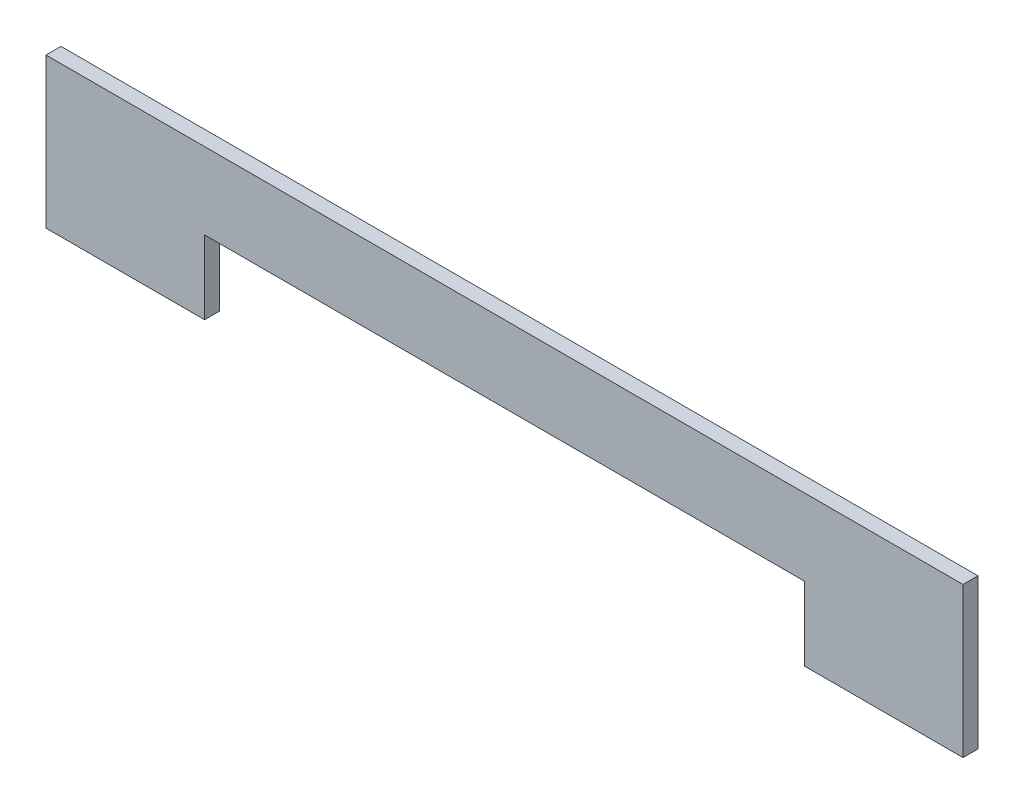
ISO-10303-21;
HEADER;
FILE_DESCRIPTION(('STEP AP214'),'2;1');
FILE_NAME('part.step','',(''),(''),'','','');
FILE_SCHEMA(('AUTOMOTIVE_DESIGN { 1 0 10303 214 1 1 1 1 }'));
ENDSEC;
DATA;
#1=APPLICATION_CONTEXT('core data for automotive mechanical design processes');
#2=APPLICATION_PROTOCOL_DEFINITION('international standard','automotive_design',2000,#1);
#3=PRODUCT_CONTEXT('',#1,'mechanical');
#4=PRODUCT('Part','Part','',(#3));
#5=PRODUCT_RELATED_PRODUCT_CATEGORY('part','',(#4));
#6=PRODUCT_DEFINITION_FORMATION('','',#4);
#7=PRODUCT_DEFINITION_CONTEXT('part definition',#1,'design');
#8=PRODUCT_DEFINITION('design','',#6,#7);
#9=PRODUCT_DEFINITION_SHAPE('','',#8);
#10=(LENGTH_UNIT() NAMED_UNIT(*) SI_UNIT(.MILLI.,.METRE.));
#11=(NAMED_UNIT(*) PLANE_ANGLE_UNIT() SI_UNIT($,.RADIAN.));
#12=(NAMED_UNIT(*) SI_UNIT($,.STERADIAN.) SOLID_ANGLE_UNIT());
#13=UNCERTAINTY_MEASURE_WITH_UNIT(LENGTH_MEASURE(1.E-05),#10,'distance_accuracy_value','');
#14=(GEOMETRIC_REPRESENTATION_CONTEXT(3) GLOBAL_UNCERTAINTY_ASSIGNED_CONTEXT((#13)) GLOBAL_UNIT_ASSIGNED_CONTEXT((#10,
#11,#12)) REPRESENTATION_CONTEXT('',''));
#15=CARTESIAN_POINT('',(0.,0.,0.));
#16=DIRECTION('',(0.,0.,1.));
#17=DIRECTION('',(1.,0.,0.));
#18=AXIS2_PLACEMENT_3D('',#15,#16,#17);
#19=CARTESIAN_POINT('',(0.,-1000.,100.));
#20=DIRECTION('',(0.,1.,0.));
#21=DIRECTION('',(0.,0.,1.));
#22=AXIS2_PLACEMENT_3D('',#19,#20,#21);
#23=PLANE('',#22);
#24=DIRECTION('',(1.,0.,0.));
#25=VECTOR('',#24,1.);
#26=CARTESIAN_POINT('',(0.,-1000.,100.));
#27=LINE('',#26,#25);
#28=CARTESIAN_POINT('',(5057.5,-1000.,100.));
#29=VERTEX_POINT('',#28);
#30=CARTESIAN_POINT('',(6115.,-1000.,100.));
#31=VERTEX_POINT('',#30);
#32=EDGE_CURVE('E121',#29,#31,#27,.T.);
#33=ORIENTED_EDGE('',*,*,#32,.F.);
#34=DIRECTION('',(0.,0.,-1.));
#35=VECTOR('',#34,1.);
#36=CARTESIAN_POINT('',(5057.5,-1000.,100.));
#37=LINE('',#36,#35);
#38=CARTESIAN_POINT('',(5057.5,-1000.,0.));
#39=VERTEX_POINT('',#38);
#40=EDGE_CURVE('E108',#29,#39,#37,.T.);
#41=ORIENTED_EDGE('',*,*,#40,.T.);
#42=DIRECTION('',(1.,0.,0.));
#43=VECTOR('',#42,1.);
#44=CARTESIAN_POINT('',(0.,-1000.,0.));
#45=LINE('',#44,#43);
#46=CARTESIAN_POINT('',(6115.,-1000.,0.));
#47=VERTEX_POINT('',#46);
#48=EDGE_CURVE('E141',#39,#47,#45,.T.);
#49=ORIENTED_EDGE('',*,*,#48,.T.);
#50=DIRECTION('',(0.,0.,-1.));
#51=VECTOR('',#50,1.);
#52=CARTESIAN_POINT('',(6115.,-1000.,100.));
#53=LINE('',#52,#51);
#54=EDGE_CURVE('E41',#31,#47,#53,.T.);
#55=ORIENTED_EDGE('',*,*,#54,.F.);
#56=EDGE_LOOP('',(#33,#41,#49,#55));
#57=FACE_BOUND('',#56,.T.);
#58=ADVANCED_FACE('F33',(#57),#23,.F.);
#59=CARTESIAN_POINT('',(0.,0.,100.));
#60=DIRECTION('',(1.,0.,0.));
#61=DIRECTION('',(0.,0.,-1.));
#62=AXIS2_PLACEMENT_3D('',#59,#60,#61);
#63=PLANE('',#62);
#64=DIRECTION('',(0.,-1.,0.));
#65=VECTOR('',#64,1.);
#66=CARTESIAN_POINT('',(0.,0.,0.));
#67=LINE('',#66,#65);
#68=CARTESIAN_POINT('',(0.,0.,0.));
#69=VERTEX_POINT('',#68);
#70=CARTESIAN_POINT('',(0.,-1000.,0.));
#71=VERTEX_POINT('',#70);
#72=EDGE_CURVE('E138',#69,#71,#67,.T.);
#73=ORIENTED_EDGE('',*,*,#72,.T.);
#74=DIRECTION('',(0.,0.,-1.));
#75=VECTOR('',#74,1.);
#76=CARTESIAN_POINT('',(0.,-1000.,100.));
#77=LINE('',#76,#75);
#78=CARTESIAN_POINT('',(0.,-1000.,100.));
#79=VERTEX_POINT('',#78);
#80=EDGE_CURVE('E11',#79,#71,#77,.T.);
#81=ORIENTED_EDGE('',*,*,#80,.F.);
#82=DIRECTION('',(0.,-1.,0.));
#83=VECTOR('',#82,1.);
#84=CARTESIAN_POINT('',(0.,0.,100.));
#85=LINE('',#84,#83);
#86=CARTESIAN_POINT('',(0.,0.,100.));
#87=VERTEX_POINT('',#86);
#88=EDGE_CURVE('E130',#87,#79,#85,.T.);
#89=ORIENTED_EDGE('',*,*,#88,.F.);
#90=DIRECTION('',(0.,0.,-1.));
#91=VECTOR('',#90,1.);
#92=CARTESIAN_POINT('',(0.,0.,100.));
#93=LINE('',#92,#91);
#94=EDGE_CURVE('E137',#87,#69,#93,.T.);
#95=ORIENTED_EDGE('',*,*,#94,.T.);
#96=EDGE_LOOP('',(#73,#81,#89,#95));
#97=FACE_BOUND('',#96,.T.);
#98=ADVANCED_FACE('F35',(#97),#63,.F.);
#99=CARTESIAN_POINT('',(1057.5,-1000.,0.));
#100=VERTEX_POINT('',#99);
#101=EDGE_CURVE('E143',#71,#100,#45,.T.);
#102=ORIENTED_EDGE('',*,*,#101,.T.);
#103=DIRECTION('',(0.,0.,-1.));
#104=VECTOR('',#103,1.);
#105=CARTESIAN_POINT('',(1057.5,-1000.,100.));
#106=LINE('',#105,#104);
#107=CARTESIAN_POINT('',(1057.5,-1000.,100.));
#108=VERTEX_POINT('',#107);
#109=EDGE_CURVE('E48',#108,#100,#106,.T.);
#110=ORIENTED_EDGE('',*,*,#109,.F.);
#111=EDGE_CURVE('E84',#79,#108,#27,.T.);
#112=ORIENTED_EDGE('',*,*,#111,.F.);
#113=ORIENTED_EDGE('',*,*,#80,.T.);
#114=EDGE_LOOP('',(#102,#110,#112,#113));
#115=FACE_BOUND('',#114,.T.);
#116=ADVANCED_FACE('F169',(#115),#23,.F.);
#117=CARTESIAN_POINT('',(6115.,0.,100.));
#118=DIRECTION('',(-1.,0.,0.));
#119=DIRECTION('',(0.,0.,1.));
#120=AXIS2_PLACEMENT_3D('',#117,#118,#119);
#121=PLANE('',#120);
#122=DIRECTION('',(0.,1.,0.));
#123=VECTOR('',#122,1.);
#124=CARTESIAN_POINT('',(6115.,0.,0.));
#125=LINE('',#124,#123);
#126=CARTESIAN_POINT('',(6115.,0.,0.));
#127=VERTEX_POINT('',#126);
#128=EDGE_CURVE('E146',#47,#127,#125,.T.);
#129=ORIENTED_EDGE('',*,*,#128,.T.);
#130=DIRECTION('',(0.,0.,-1.));
#131=VECTOR('',#130,1.);
#132=CARTESIAN_POINT('',(6115.,0.,100.));
#133=LINE('',#132,#131);
#134=CARTESIAN_POINT('',(6115.,0.,100.));
#135=VERTEX_POINT('',#134);
#136=EDGE_CURVE('E150',#135,#127,#133,.T.);
#137=ORIENTED_EDGE('',*,*,#136,.F.);
#138=DIRECTION('',(0.,1.,0.));
#139=VECTOR('',#138,1.);
#140=CARTESIAN_POINT('',(6115.,0.,100.));
#141=LINE('',#140,#139);
#142=EDGE_CURVE('E132',#31,#135,#141,.T.);
#143=ORIENTED_EDGE('',*,*,#142,.F.);
#144=ORIENTED_EDGE('',*,*,#54,.T.);
#145=EDGE_LOOP('',(#129,#137,#143,#144));
#146=FACE_BOUND('',#145,.T.);
#147=ADVANCED_FACE('F153',(#146),#121,.F.);
#148=CARTESIAN_POINT('',(0.,0.,100.));
#149=DIRECTION('',(0.,-1.,0.));
#150=DIRECTION('',(0.,0.,-1.));
#151=AXIS2_PLACEMENT_3D('',#148,#149,#150);
#152=PLANE('',#151);
#153=DIRECTION('',(-1.,0.,0.));
#154=VECTOR('',#153,1.);
#155=CARTESIAN_POINT('',(0.,0.,0.));
#156=LINE('',#155,#154);
#157=EDGE_CURVE('E78',#127,#69,#156,.T.);
#158=ORIENTED_EDGE('',*,*,#157,.T.);
#159=ORIENTED_EDGE('',*,*,#94,.F.);
#160=DIRECTION('',(-1.,0.,0.));
#161=VECTOR('',#160,1.);
#162=CARTESIAN_POINT('',(0.,0.,100.));
#163=LINE('',#162,#161);
#164=EDGE_CURVE('E57',#135,#87,#163,.T.);
#165=ORIENTED_EDGE('',*,*,#164,.F.);
#166=ORIENTED_EDGE('',*,*,#136,.T.);
#167=EDGE_LOOP('',(#158,#159,#165,#166));
#168=FACE_BOUND('',#167,.T.);
#169=ADVANCED_FACE('F161',(#168),#152,.F.);
#170=CARTESIAN_POINT('',(0.,0.,100.));
#171=DIRECTION('',(0.,0.,1.));
#172=DIRECTION('',(1.,0.,0.));
#173=AXIS2_PLACEMENT_3D('',#170,#171,#172);
#174=PLANE('',#173);
#175=DIRECTION('',(0.,-1.,0.));
#176=VECTOR('',#175,1.);
#177=CARTESIAN_POINT('',(5057.5,-510.,100.));
#178=LINE('',#177,#176);
#179=CARTESIAN_POINT('',(5057.5,-510.,100.));
#180=VERTEX_POINT('',#179);
#181=EDGE_CURVE('E111',#180,#29,#178,.T.);
#182=ORIENTED_EDGE('',*,*,#181,.T.);
#183=ORIENTED_EDGE('',*,*,#32,.T.);
#184=ORIENTED_EDGE('',*,*,#142,.T.);
#185=ORIENTED_EDGE('',*,*,#164,.T.);
#186=ORIENTED_EDGE('',*,*,#88,.T.);
#187=ORIENTED_EDGE('',*,*,#111,.T.);
#188=DIRECTION('',(0.,1.,0.));
#189=VECTOR('',#188,1.);
#190=CARTESIAN_POINT('',(1057.5,-510.,100.));
#191=LINE('',#190,#189);
#192=CARTESIAN_POINT('',(1057.5,-510.,100.));
#193=VERTEX_POINT('',#192);
#194=EDGE_CURVE('E125',#108,#193,#191,.T.);
#195=ORIENTED_EDGE('',*,*,#194,.T.);
#196=DIRECTION('',(1.,0.,0.));
#197=VECTOR('',#196,1.);
#198=CARTESIAN_POINT('',(5057.5,-510.,100.));
#199=LINE('',#198,#197);
#200=EDGE_CURVE('E118',#193,#180,#199,.T.);
#201=ORIENTED_EDGE('',*,*,#200,.T.);
#202=EDGE_LOOP('',(#182,#183,#184,#185,#186,#187,#195,#201));
#203=FACE_BOUND('',#202,.T.);
#204=ADVANCED_FACE('F120',(#203),#174,.T.);
#205=CARTESIAN_POINT('',(0.,0.,0.));
#206=DIRECTION('',(0.,0.,1.));
#207=DIRECTION('',(1.,0.,0.));
#208=AXIS2_PLACEMENT_3D('',#205,#206,#207);
#209=PLANE('',#208);
#210=ORIENTED_EDGE('',*,*,#48,.F.);
#211=DIRECTION('',(0.,-1.,0.));
#212=VECTOR('',#211,1.);
#213=CARTESIAN_POINT('',(5057.5,-510.,0.));
#214=LINE('',#213,#212);
#215=CARTESIAN_POINT('',(5057.5,-510.,0.));
#216=VERTEX_POINT('',#215);
#217=EDGE_CURVE('E114',#216,#39,#214,.T.);
#218=ORIENTED_EDGE('',*,*,#217,.F.);
#219=DIRECTION('',(1.,0.,0.));
#220=VECTOR('',#219,1.);
#221=CARTESIAN_POINT('',(5057.5,-510.,0.));
#222=LINE('',#221,#220);
#223=CARTESIAN_POINT('',(1057.5,-510.,0.));
#224=VERTEX_POINT('',#223);
#225=EDGE_CURVE('E126',#224,#216,#222,.T.);
#226=ORIENTED_EDGE('',*,*,#225,.F.);
#227=DIRECTION('',(0.,1.,0.));
#228=VECTOR('',#227,1.);
#229=CARTESIAN_POINT('',(1057.5,-510.,0.));
#230=LINE('',#229,#228);
#231=EDGE_CURVE('E185',#100,#224,#230,.T.);
#232=ORIENTED_EDGE('',*,*,#231,.F.);
#233=ORIENTED_EDGE('',*,*,#101,.F.);
#234=ORIENTED_EDGE('',*,*,#72,.F.);
#235=ORIENTED_EDGE('',*,*,#157,.F.);
#236=ORIENTED_EDGE('',*,*,#128,.F.);
#237=EDGE_LOOP('',(#210,#218,#226,#232,#233,#234,#235,#236));
#238=FACE_BOUND('',#237,.T.);
#239=ADVANCED_FACE('F156',(#238),#209,.F.);
#240=CARTESIAN_POINT('',(5057.5,-510.,100.));
#241=DIRECTION('',(1.,0.,0.));
#242=DIRECTION('',(0.,0.,-1.));
#243=AXIS2_PLACEMENT_3D('',#240,#241,#242);
#244=PLANE('',#243);
#245=ORIENTED_EDGE('',*,*,#217,.T.);
#246=ORIENTED_EDGE('',*,*,#40,.F.);
#247=ORIENTED_EDGE('',*,*,#181,.F.);
#248=DIRECTION('',(0.,0.,-1.));
#249=VECTOR('',#248,1.);
#250=CARTESIAN_POINT('',(5057.5,-510.,100.));
#251=LINE('',#250,#249);
#252=EDGE_CURVE('E142',#180,#216,#251,.T.);
#253=ORIENTED_EDGE('',*,*,#252,.T.);
#254=EDGE_LOOP('',(#245,#246,#247,#253));
#255=FACE_BOUND('',#254,.T.);
#256=ADVANCED_FACE('F110',(#255),#244,.F.);
#257=CARTESIAN_POINT('',(5057.5,-510.,100.));
#258=DIRECTION('',(0.,1.,0.));
#259=DIRECTION('',(0.,0.,1.));
#260=AXIS2_PLACEMENT_3D('',#257,#258,#259);
#261=PLANE('',#260);
#262=ORIENTED_EDGE('',*,*,#225,.T.);
#263=ORIENTED_EDGE('',*,*,#252,.F.);
#264=ORIENTED_EDGE('',*,*,#200,.F.);
#265=DIRECTION('',(0.,0.,-1.));
#266=VECTOR('',#265,1.);
#267=CARTESIAN_POINT('',(1057.5,-510.,100.));
#268=LINE('',#267,#266);
#269=EDGE_CURVE('E179',#193,#224,#268,.T.);
#270=ORIENTED_EDGE('',*,*,#269,.T.);
#271=EDGE_LOOP('',(#262,#263,#264,#270));
#272=FACE_BOUND('',#271,.T.);
#273=ADVANCED_FACE('F191',(#272),#261,.F.);
#274=CARTESIAN_POINT('',(1057.5,-510.,100.));
#275=DIRECTION('',(-1.,0.,0.));
#276=DIRECTION('',(0.,0.,1.));
#277=AXIS2_PLACEMENT_3D('',#274,#275,#276);
#278=PLANE('',#277);
#279=ORIENTED_EDGE('',*,*,#231,.T.);
#280=ORIENTED_EDGE('',*,*,#269,.F.);
#281=ORIENTED_EDGE('',*,*,#194,.F.);
#282=ORIENTED_EDGE('',*,*,#109,.T.);
#283=EDGE_LOOP('',(#279,#280,#281,#282));
#284=FACE_BOUND('',#283,.T.);
#285=ADVANCED_FACE('F193',(#284),#278,.F.);
#286=CLOSED_SHELL('',(#58,#98,#116,#147,#169,#204,#239,#256,#273,#285));
#287=MANIFOLD_SOLID_BREP('B2',#286);
#288=ADVANCED_BREP_SHAPE_REPRESENTATION('',(#18,#287),#14);
#289=SHAPE_DEFINITION_REPRESENTATION(#9,#288);
ENDSEC;
END-ISO-10303-21;
